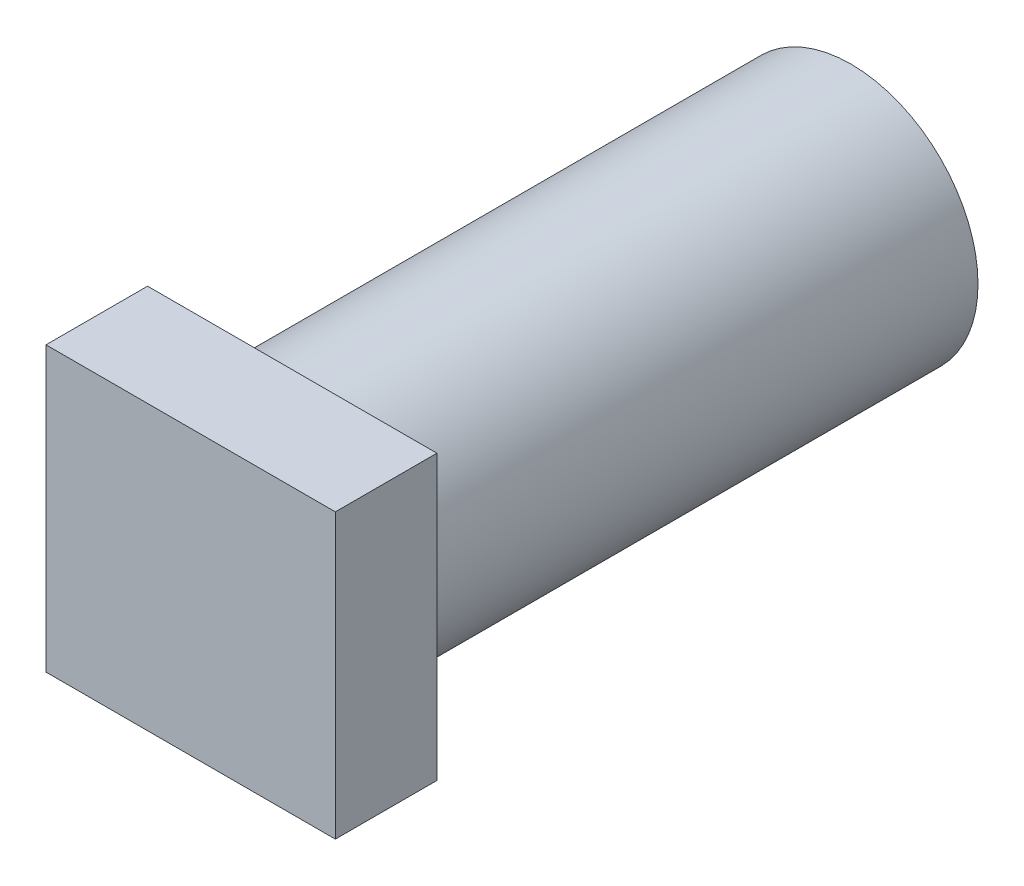
ISO-10303-21;
HEADER;
FILE_DESCRIPTION(('STEP AP214'),'2;1');
FILE_NAME('part.step','',(''),(''),'','','');
FILE_SCHEMA(('AUTOMOTIVE_DESIGN { 1 0 10303 214 1 1 1 1 }'));
ENDSEC;
DATA;
#1=APPLICATION_CONTEXT('core data for automotive mechanical design processes');
#2=APPLICATION_PROTOCOL_DEFINITION('international standard','automotive_design',2000,#1);
#3=PRODUCT_CONTEXT('',#1,'mechanical');
#4=PRODUCT('Part','Part','',(#3));
#5=PRODUCT_RELATED_PRODUCT_CATEGORY('part','',(#4));
#6=PRODUCT_DEFINITION_FORMATION('','',#4);
#7=PRODUCT_DEFINITION_CONTEXT('part definition',#1,'design');
#8=PRODUCT_DEFINITION('design','',#6,#7);
#9=PRODUCT_DEFINITION_SHAPE('','',#8);
#10=(LENGTH_UNIT() NAMED_UNIT(*) SI_UNIT(.MILLI.,.METRE.));
#11=(NAMED_UNIT(*) PLANE_ANGLE_UNIT() SI_UNIT($,.RADIAN.));
#12=(NAMED_UNIT(*) SI_UNIT($,.STERADIAN.) SOLID_ANGLE_UNIT());
#13=UNCERTAINTY_MEASURE_WITH_UNIT(LENGTH_MEASURE(1.E-05),#10,'distance_accuracy_value','');
#14=(GEOMETRIC_REPRESENTATION_CONTEXT(3) GLOBAL_UNCERTAINTY_ASSIGNED_CONTEXT((#13)) GLOBAL_UNIT_ASSIGNED_CONTEXT((#10,
#11,#12)) REPRESENTATION_CONTEXT('',''));
#15=CARTESIAN_POINT('',(0.,0.,0.));
#16=DIRECTION('',(0.,0.,1.));
#17=DIRECTION('',(1.,0.,0.));
#18=AXIS2_PLACEMENT_3D('',#15,#16,#17);
#19=CARTESIAN_POINT('',(0.,0.,11.));
#20=DIRECTION('',(0.,0.,-1.));
#21=DIRECTION('',(-1.,0.,0.));
#22=AXIS2_PLACEMENT_3D('',#19,#20,#21);
#23=CYLINDRICAL_SURFACE('',#22,2.5);
#24=CARTESIAN_POINT('',(0.,0.,11.));
#25=DIRECTION('',(0.,0.,1.));
#26=DIRECTION('',(1.,0.,0.));
#27=AXIS2_PLACEMENT_3D('',#24,#25,#26);
#28=CIRCLE('',#27,2.5);
#29=CARTESIAN_POINT('',(2.5,0.,11.));
#30=VERTEX_POINT('',#29);
#31=EDGE_CURVE('E11',#30,#30,#28,.T.);
#32=ORIENTED_EDGE('',*,*,#31,.F.);
#33=EDGE_LOOP('',(#32));
#34=FACE_BOUND('',#33,.T.);
#35=CARTESIAN_POINT('',(0.,0.,0.));
#36=DIRECTION('',(0.,0.,1.));
#37=DIRECTION('',(1.,0.,0.));
#38=AXIS2_PLACEMENT_3D('',#35,#36,#37);
#39=CIRCLE('',#38,2.5);
#40=CARTESIAN_POINT('',(2.5,0.,0.));
#41=VERTEX_POINT('',#40);
#42=EDGE_CURVE('E49',#41,#41,#39,.T.);
#43=ORIENTED_EDGE('',*,*,#42,.T.);
#44=EDGE_LOOP('',(#43));
#45=FACE_BOUND('',#44,.T.);
#46=ADVANCED_FACE('F46',(#34,#45),#23,.T.);
#47=CARTESIAN_POINT('',(0.,0.,0.));
#48=DIRECTION('',(0.,0.,1.));
#49=DIRECTION('',(1.,0.,0.));
#50=AXIS2_PLACEMENT_3D('',#47,#48,#49);
#51=PLANE('',#50);
#52=CARTESIAN_POINT('',(0.,0.,0.));
#53=DIRECTION('',(0.,0.,-1.));
#54=DIRECTION('',(-1.,0.,0.));
#55=AXIS2_PLACEMENT_3D('',#52,#53,#54);
#56=CIRCLE('',#55,2.025);
#57=CARTESIAN_POINT('',(-2.025,0.,0.));
#58=VERTEX_POINT('',#57);
#59=EDGE_CURVE('E115',#58,#58,#56,.T.);
#60=ORIENTED_EDGE('',*,*,#59,.F.);
#61=EDGE_LOOP('',(#60));
#62=FACE_BOUND('',#61,.T.);
#63=ORIENTED_EDGE('',*,*,#42,.F.);
#64=EDGE_LOOP('',(#63));
#65=FACE_BOUND('',#64,.T.);
#66=ADVANCED_FACE('F140',(#62,#65),#51,.F.);
#67=CARTESIAN_POINT('',(2.84800919804541,2.79012283223145,13.));
#68=DIRECTION('',(-1.,0.,0.));
#69=DIRECTION('',(0.,0.,1.));
#70=AXIS2_PLACEMENT_3D('',#67,#68,#69);
#71=PLANE('',#70);
#72=DIRECTION('',(0.,1.,0.));
#73=VECTOR('',#72,1.);
#74=CARTESIAN_POINT('',(2.84800919804541,2.79012283223145,11.));
#75=LINE('',#74,#73);
#76=CARTESIAN_POINT('',(2.84800919804541,-2.79012283223145,11.));
#77=VERTEX_POINT('',#76);
#78=CARTESIAN_POINT('',(2.84800919804541,2.79012283223145,11.));
#79=VERTEX_POINT('',#78);
#80=EDGE_CURVE('E108',#77,#79,#75,.T.);
#81=ORIENTED_EDGE('',*,*,#80,.T.);
#82=DIRECTION('',(0.,0.,-1.));
#83=VECTOR('',#82,1.);
#84=CARTESIAN_POINT('',(2.84800919804541,2.79012283223145,13.));
#85=LINE('',#84,#83);
#86=CARTESIAN_POINT('',(2.84800919804541,2.79012283223145,13.));
#87=VERTEX_POINT('',#86);
#88=EDGE_CURVE('E134',#87,#79,#85,.T.);
#89=ORIENTED_EDGE('',*,*,#88,.F.);
#90=DIRECTION('',(0.,1.,0.));
#91=VECTOR('',#90,1.);
#92=CARTESIAN_POINT('',(2.84800919804541,2.79012283223145,13.));
#93=LINE('',#92,#91);
#94=CARTESIAN_POINT('',(2.84800919804541,-2.79012283223145,13.));
#95=VERTEX_POINT('',#94);
#96=EDGE_CURVE('E119',#95,#87,#93,.T.);
#97=ORIENTED_EDGE('',*,*,#96,.F.);
#98=DIRECTION('',(0.,0.,-1.));
#99=VECTOR('',#98,1.);
#100=CARTESIAN_POINT('',(2.84800919804541,-2.79012283223145,13.));
#101=LINE('',#100,#99);
#102=EDGE_CURVE('E124',#95,#77,#101,.T.);
#103=ORIENTED_EDGE('',*,*,#102,.T.);
#104=EDGE_LOOP('',(#81,#89,#97,#103));
#105=FACE_BOUND('',#104,.T.);
#106=ADVANCED_FACE('F142',(#105),#71,.F.);
#107=CARTESIAN_POINT('',(-2.84800919804541,2.79012283223145,13.));
#108=DIRECTION('',(0.,-1.,0.));
#109=DIRECTION('',(0.,0.,-1.));
#110=AXIS2_PLACEMENT_3D('',#107,#108,#109);
#111=PLANE('',#110);
#112=DIRECTION('',(-1.,0.,0.));
#113=VECTOR('',#112,1.);
#114=CARTESIAN_POINT('',(-2.84800919804541,2.79012283223145,11.));
#115=LINE('',#114,#113);
#116=CARTESIAN_POINT('',(-2.84800919804541,2.79012283223145,11.));
#117=VERTEX_POINT('',#116);
#118=EDGE_CURVE('E112',#79,#117,#115,.T.);
#119=ORIENTED_EDGE('',*,*,#118,.T.);
#120=DIRECTION('',(0.,0.,-1.));
#121=VECTOR('',#120,1.);
#122=CARTESIAN_POINT('',(-2.84800919804541,2.79012283223145,13.));
#123=LINE('',#122,#121);
#124=CARTESIAN_POINT('',(-2.84800919804541,2.79012283223145,13.));
#125=VERTEX_POINT('',#124);
#126=EDGE_CURVE('E132',#125,#117,#123,.T.);
#127=ORIENTED_EDGE('',*,*,#126,.F.);
#128=DIRECTION('',(-1.,0.,0.));
#129=VECTOR('',#128,1.);
#130=CARTESIAN_POINT('',(-2.84800919804541,2.79012283223145,13.));
#131=LINE('',#130,#129);
#132=EDGE_CURVE('E94',#87,#125,#131,.T.);
#133=ORIENTED_EDGE('',*,*,#132,.F.);
#134=ORIENTED_EDGE('',*,*,#88,.T.);
#135=EDGE_LOOP('',(#119,#127,#133,#134));
#136=FACE_BOUND('',#135,.T.);
#137=ADVANCED_FACE('F148',(#136),#111,.F.);
#138=CARTESIAN_POINT('',(-2.84800919804541,2.79012283223145,13.));
#139=DIRECTION('',(1.,0.,0.));
#140=DIRECTION('',(0.,0.,-1.));
#141=AXIS2_PLACEMENT_3D('',#138,#139,#140);
#142=PLANE('',#141);
#143=DIRECTION('',(0.,-1.,0.));
#144=VECTOR('',#143,1.);
#145=CARTESIAN_POINT('',(-2.84800919804541,2.79012283223145,11.));
#146=LINE('',#145,#144);
#147=CARTESIAN_POINT('',(-2.84800919804541,-2.79012283223145,11.));
#148=VERTEX_POINT('',#147);
#149=EDGE_CURVE('E80',#117,#148,#146,.T.);
#150=ORIENTED_EDGE('',*,*,#149,.T.);
#151=DIRECTION('',(0.,0.,-1.));
#152=VECTOR('',#151,1.);
#153=CARTESIAN_POINT('',(-2.84800919804541,-2.79012283223145,13.));
#154=LINE('',#153,#152);
#155=CARTESIAN_POINT('',(-2.84800919804541,-2.79012283223145,13.));
#156=VERTEX_POINT('',#155);
#157=EDGE_CURVE('E130',#156,#148,#154,.T.);
#158=ORIENTED_EDGE('',*,*,#157,.F.);
#159=DIRECTION('',(0.,-1.,0.));
#160=VECTOR('',#159,1.);
#161=CARTESIAN_POINT('',(-2.84800919804541,2.79012283223145,13.));
#162=LINE('',#161,#160);
#163=EDGE_CURVE('E122',#125,#156,#162,.T.);
#164=ORIENTED_EDGE('',*,*,#163,.F.);
#165=ORIENTED_EDGE('',*,*,#126,.T.);
#166=EDGE_LOOP('',(#150,#158,#164,#165));
#167=FACE_BOUND('',#166,.T.);
#168=ADVANCED_FACE('F156',(#167),#142,.F.);
#169=CARTESIAN_POINT('',(-2.84800919804541,-2.79012283223145,13.));
#170=DIRECTION('',(0.,1.,0.));
#171=DIRECTION('',(0.,0.,1.));
#172=AXIS2_PLACEMENT_3D('',#169,#170,#171);
#173=PLANE('',#172);
#174=DIRECTION('',(1.,0.,0.));
#175=VECTOR('',#174,1.);
#176=CARTESIAN_POINT('',(-2.84800919804541,-2.79012283223145,11.));
#177=LINE('',#176,#175);
#178=EDGE_CURVE('E86',#148,#77,#177,.T.);
#179=ORIENTED_EDGE('',*,*,#178,.T.);
#180=ORIENTED_EDGE('',*,*,#102,.F.);
#181=DIRECTION('',(1.,0.,0.));
#182=VECTOR('',#181,1.);
#183=CARTESIAN_POINT('',(-2.84800919804541,-2.79012283223145,13.));
#184=LINE('',#183,#182);
#185=EDGE_CURVE('E62',#156,#95,#184,.T.);
#186=ORIENTED_EDGE('',*,*,#185,.F.);
#187=ORIENTED_EDGE('',*,*,#157,.T.);
#188=EDGE_LOOP('',(#179,#180,#186,#187));
#189=FACE_BOUND('',#188,.T.);
#190=ADVANCED_FACE('F159',(#189),#173,.F.);
#191=CARTESIAN_POINT('',(0.,0.,13.));
#192=DIRECTION('',(0.,0.,1.));
#193=DIRECTION('',(1.,0.,0.));
#194=AXIS2_PLACEMENT_3D('',#191,#192,#193);
#195=PLANE('',#194);
#196=ORIENTED_EDGE('',*,*,#96,.T.);
#197=ORIENTED_EDGE('',*,*,#132,.T.);
#198=ORIENTED_EDGE('',*,*,#163,.T.);
#199=ORIENTED_EDGE('',*,*,#185,.T.);
#200=EDGE_LOOP('',(#196,#197,#198,#199));
#201=FACE_BOUND('',#200,.T.);
#202=ADVANCED_FACE('F162',(#201),#195,.T.);
#203=CARTESIAN_POINT('',(0.,0.,11.));
#204=DIRECTION('',(0.,0.,1.));
#205=DIRECTION('',(1.,0.,0.));
#206=AXIS2_PLACEMENT_3D('',#203,#204,#205);
#207=PLANE('',#206);
#208=ORIENTED_EDGE('',*,*,#31,.T.);
#209=EDGE_LOOP('',(#208));
#210=FACE_BOUND('',#209,.T.);
#211=ORIENTED_EDGE('',*,*,#80,.F.);
#212=ORIENTED_EDGE('',*,*,#178,.F.);
#213=ORIENTED_EDGE('',*,*,#149,.F.);
#214=ORIENTED_EDGE('',*,*,#118,.F.);
#215=EDGE_LOOP('',(#211,#212,#213,#214));
#216=FACE_BOUND('',#215,.T.);
#217=ADVANCED_FACE('F102',(#210,#216),#207,.F.);
#218=CARTESIAN_POINT('',(0.,0.,10.1));
#219=DIRECTION('',(0.,0.,-1.));
#220=DIRECTION('',(-1.,0.,0.));
#221=AXIS2_PLACEMENT_3D('',#218,#219,#220);
#222=CONICAL_SURFACE('',#221,1.65,1.02974425867665);
#223=CARTESIAN_POINT('',(0.,0.,11.0914200213955));
#224=VERTEX_POINT('',#223);
#225=VERTEX_LOOP('',#224);
#226=FACE_BOUND('',#225,.T.);
#227=CARTESIAN_POINT('',(0.,0.,10.1));
#228=DIRECTION('',(0.,0.,-1.));
#229=DIRECTION('',(-1.,0.,0.));
#230=AXIS2_PLACEMENT_3D('',#227,#228,#229);
#231=CIRCLE('',#230,1.65);
#232=CARTESIAN_POINT('',(-1.65,0.,10.1));
#233=VERTEX_POINT('',#232);
#234=EDGE_CURVE('E106',#233,#233,#231,.T.);
#235=ORIENTED_EDGE('',*,*,#234,.T.);
#236=EDGE_LOOP('',(#235));
#237=FACE_BOUND('',#236,.T.);
#238=ADVANCED_FACE('F98',(#226,#237),#222,.F.);
#239=CARTESIAN_POINT('',(0.,0.,0.));
#240=DIRECTION('',(0.,0.,-1.));
#241=DIRECTION('',(-1.,0.,0.));
#242=AXIS2_PLACEMENT_3D('',#239,#240,#241);
#243=CYLINDRICAL_SURFACE('',#242,1.65);
#244=ORIENTED_EDGE('',*,*,#234,.F.);
#245=EDGE_LOOP('',(#244));
#246=FACE_BOUND('',#245,.T.);
#247=CARTESIAN_POINT('',(0.,0.,0.375));
#248=DIRECTION('',(0.,0.,-1.));
#249=DIRECTION('',(-1.,0.,0.));
#250=AXIS2_PLACEMENT_3D('',#247,#248,#249);
#251=CIRCLE('',#250,1.65);
#252=CARTESIAN_POINT('',(-1.65,0.,0.375));
#253=VERTEX_POINT('',#252);
#254=EDGE_CURVE('E109',#253,#253,#251,.T.);
#255=ORIENTED_EDGE('',*,*,#254,.T.);
#256=EDGE_LOOP('',(#255));
#257=FACE_BOUND('',#256,.T.);
#258=ADVANCED_FACE('F101',(#246,#257),#243,.F.);
#259=CARTESIAN_POINT('',(0.,0.,0.));
#260=DIRECTION('',(0.,0.,-1.));
#261=DIRECTION('',(-1.,0.,0.));
#262=AXIS2_PLACEMENT_3D('',#259,#260,#261);
#263=CONICAL_SURFACE('',#262,2.025,0.78539816339745);
#264=ORIENTED_EDGE('',*,*,#254,.F.);
#265=EDGE_LOOP('',(#264));
#266=FACE_BOUND('',#265,.T.);
#267=ORIENTED_EDGE('',*,*,#59,.T.);
#268=EDGE_LOOP('',(#267));
#269=FACE_BOUND('',#268,.T.);
#270=ADVANCED_FACE('F170',(#266,#269),#263,.F.);
#271=CLOSED_SHELL('',(#46,#66,#106,#137,#168,#190,#202,#217,#238,#258,#270));
#272=MANIFOLD_SOLID_BREP('B2',#271);
#273=ADVANCED_BREP_SHAPE_REPRESENTATION('',(#18,#272),#14);
#274=SHAPE_DEFINITION_REPRESENTATION(#9,#273);
ENDSEC;
END-ISO-10303-21;
